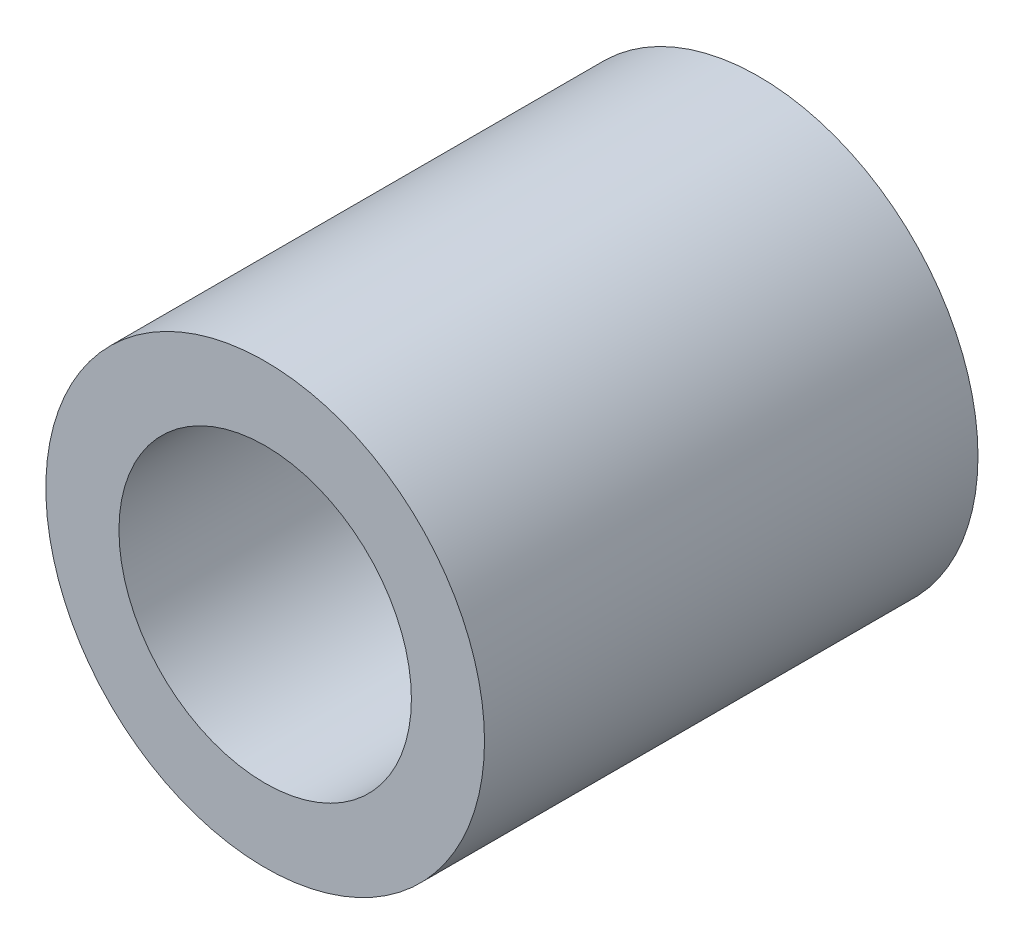
ISO-10303-21;
HEADER;
FILE_DESCRIPTION(('STEP AP214'),'2;1');
FILE_NAME('part.step','',(''),(''),'','','');
FILE_SCHEMA(('AUTOMOTIVE_DESIGN { 1 0 10303 214 1 1 1 1 }'));
ENDSEC;
DATA;
#1=APPLICATION_CONTEXT('core data for automotive mechanical design processes');
#2=APPLICATION_PROTOCOL_DEFINITION('international standard','automotive_design',2000,#1);
#3=PRODUCT_CONTEXT('',#1,'mechanical');
#4=PRODUCT('Part','Part','',(#3));
#5=PRODUCT_RELATED_PRODUCT_CATEGORY('part','',(#4));
#6=PRODUCT_DEFINITION_FORMATION('','',#4);
#7=PRODUCT_DEFINITION_CONTEXT('part definition',#1,'design');
#8=PRODUCT_DEFINITION('design','',#6,#7);
#9=PRODUCT_DEFINITION_SHAPE('','',#8);
#10=(LENGTH_UNIT() NAMED_UNIT(*) SI_UNIT(.MILLI.,.METRE.));
#11=(NAMED_UNIT(*) PLANE_ANGLE_UNIT() SI_UNIT($,.RADIAN.));
#12=(NAMED_UNIT(*) SI_UNIT($,.STERADIAN.) SOLID_ANGLE_UNIT());
#13=UNCERTAINTY_MEASURE_WITH_UNIT(LENGTH_MEASURE(1.E-05),#10,'distance_accuracy_value','');
#14=(GEOMETRIC_REPRESENTATION_CONTEXT(3) GLOBAL_UNCERTAINTY_ASSIGNED_CONTEXT((#13)) GLOBAL_UNIT_ASSIGNED_CONTEXT((#10,
#11,#12)) REPRESENTATION_CONTEXT('',''));
#15=CARTESIAN_POINT('',(0.,0.,0.));
#16=DIRECTION('',(0.,0.,1.));
#17=DIRECTION('',(1.,0.,0.));
#18=AXIS2_PLACEMENT_3D('',#15,#16,#17);
#19=CARTESIAN_POINT('',(0.,0.,5.3578125));
#20=DIRECTION('',(0.,0.,1.));
#21=DIRECTION('',(1.,0.,0.));
#22=AXIS2_PLACEMENT_3D('',#19,#20,#21);
#23=PLANE('',#22);
#24=CARTESIAN_POINT('',(0.,0.,5.3578125));
#25=DIRECTION('',(0.,0.,1.));
#26=DIRECTION('',(1.,0.,0.));
#27=AXIS2_PLACEMENT_3D('',#24,#25,#26);
#28=CIRCLE('',#27,2.38125);
#29=CARTESIAN_POINT('',(2.38125,0.,5.3578125));
#30=VERTEX_POINT('',#29);
#31=EDGE_CURVE('E10',#30,#30,#28,.T.);
#32=ORIENTED_EDGE('',*,*,#31,.T.);
#33=EDGE_LOOP('',(#32));
#34=FACE_BOUND('',#33,.T.);
#35=CARTESIAN_POINT('',(0.,0.,5.3578125));
#36=DIRECTION('',(0.,0.,1.));
#37=DIRECTION('',(1.,0.,0.));
#38=AXIS2_PLACEMENT_3D('',#35,#36,#37);
#39=CIRCLE('',#38,1.5875);
#40=CARTESIAN_POINT('',(1.5875,0.,5.3578125));
#41=VERTEX_POINT('',#40);
#42=EDGE_CURVE('E56',#41,#41,#39,.T.);
#43=ORIENTED_EDGE('',*,*,#42,.F.);
#44=EDGE_LOOP('',(#43));
#45=FACE_BOUND('',#44,.T.);
#46=ADVANCED_FACE('F43',(#34,#45),#23,.T.);
#47=CARTESIAN_POINT('',(0.,0.,0.));
#48=DIRECTION('',(0.,0.,1.));
#49=DIRECTION('',(1.,0.,0.));
#50=AXIS2_PLACEMENT_3D('',#47,#48,#49);
#51=PLANE('',#50);
#52=CARTESIAN_POINT('',(0.,0.,0.));
#53=DIRECTION('',(0.,0.,1.));
#54=DIRECTION('',(1.,0.,0.));
#55=AXIS2_PLACEMENT_3D('',#52,#53,#54);
#56=CIRCLE('',#55,2.38125);
#57=CARTESIAN_POINT('',(2.38125,0.,0.));
#58=VERTEX_POINT('',#57);
#59=EDGE_CURVE('E47',#58,#58,#56,.T.);
#60=ORIENTED_EDGE('',*,*,#59,.F.);
#61=EDGE_LOOP('',(#60));
#62=FACE_BOUND('',#61,.T.);
#63=CARTESIAN_POINT('',(0.,0.,0.));
#64=DIRECTION('',(0.,0.,1.));
#65=DIRECTION('',(1.,0.,0.));
#66=AXIS2_PLACEMENT_3D('',#63,#64,#65);
#67=CIRCLE('',#66,1.5875);
#68=CARTESIAN_POINT('',(1.5875,0.,0.));
#69=VERTEX_POINT('',#68);
#70=EDGE_CURVE('E58',#69,#69,#67,.T.);
#71=ORIENTED_EDGE('',*,*,#70,.T.);
#72=EDGE_LOOP('',(#71));
#73=FACE_BOUND('',#72,.T.);
#74=ADVANCED_FACE('F70',(#62,#73),#51,.F.);
#75=CARTESIAN_POINT('',(0.,0.,5.3578125));
#76=DIRECTION('',(0.,0.,-1.));
#77=DIRECTION('',(-1.,0.,0.));
#78=AXIS2_PLACEMENT_3D('',#75,#76,#77);
#79=CYLINDRICAL_SURFACE('',#78,2.38125);
#80=ORIENTED_EDGE('',*,*,#31,.F.);
#81=EDGE_LOOP('',(#80));
#82=FACE_BOUND('',#81,.T.);
#83=ORIENTED_EDGE('',*,*,#59,.T.);
#84=EDGE_LOOP('',(#83));
#85=FACE_BOUND('',#84,.T.);
#86=ADVANCED_FACE('F45',(#82,#85),#79,.T.);
#87=CARTESIAN_POINT('',(0.,0.,5.3578125));
#88=DIRECTION('',(0.,0.,-1.));
#89=DIRECTION('',(-1.,0.,0.));
#90=AXIS2_PLACEMENT_3D('',#87,#88,#89);
#91=CYLINDRICAL_SURFACE('',#90,1.5875);
#92=ORIENTED_EDGE('',*,*,#42,.T.);
#93=EDGE_LOOP('',(#92));
#94=FACE_BOUND('',#93,.T.);
#95=ORIENTED_EDGE('',*,*,#70,.F.);
#96=EDGE_LOOP('',(#95));
#97=FACE_BOUND('',#96,.T.);
#98=ADVANCED_FACE('F66',(#94,#97),#91,.F.);
#99=CLOSED_SHELL('',(#46,#74,#86,#98));
#100=MANIFOLD_SOLID_BREP('B2',#99);
#101=ADVANCED_BREP_SHAPE_REPRESENTATION('',(#18,#100),#14);
#102=SHAPE_DEFINITION_REPRESENTATION(#9,#101);
ENDSEC;
END-ISO-10303-21;
